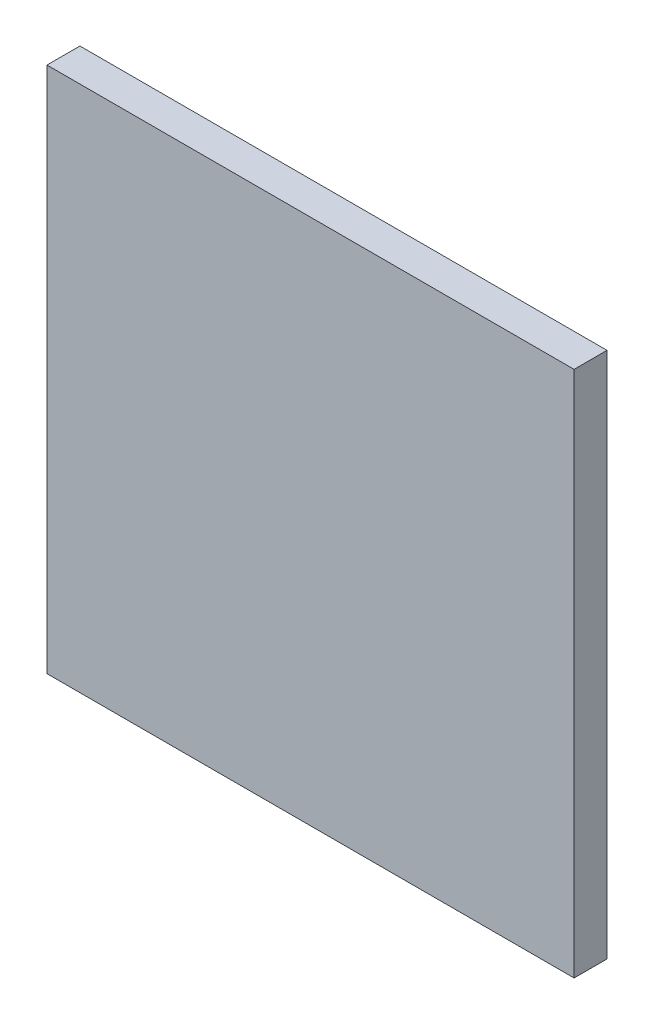
ISO-10303-21;
HEADER;
FILE_DESCRIPTION(('STEP AP214'),'2;1');
FILE_NAME('part.step','',(''),(''),'','','');
FILE_SCHEMA(('AUTOMOTIVE_DESIGN { 1 0 10303 214 1 1 1 1 }'));
ENDSEC;
DATA;
#1=APPLICATION_CONTEXT('core data for automotive mechanical design processes');
#2=APPLICATION_PROTOCOL_DEFINITION('international standard','automotive_design',2000,#1);
#3=PRODUCT_CONTEXT('',#1,'mechanical');
#4=PRODUCT('Part','Part','',(#3));
#5=PRODUCT_RELATED_PRODUCT_CATEGORY('part','',(#4));
#6=PRODUCT_DEFINITION_FORMATION('','',#4);
#7=PRODUCT_DEFINITION_CONTEXT('part definition',#1,'design');
#8=PRODUCT_DEFINITION('design','',#6,#7);
#9=PRODUCT_DEFINITION_SHAPE('','',#8);
#10=(LENGTH_UNIT() NAMED_UNIT(*) SI_UNIT(.MILLI.,.METRE.));
#11=(NAMED_UNIT(*) PLANE_ANGLE_UNIT() SI_UNIT($,.RADIAN.));
#12=(NAMED_UNIT(*) SI_UNIT($,.STERADIAN.) SOLID_ANGLE_UNIT());
#13=UNCERTAINTY_MEASURE_WITH_UNIT(LENGTH_MEASURE(1.E-05),#10,'distance_accuracy_value','');
#14=(GEOMETRIC_REPRESENTATION_CONTEXT(3) GLOBAL_UNCERTAINTY_ASSIGNED_CONTEXT((#13)) GLOBAL_UNIT_ASSIGNED_CONTEXT((#10,
#11,#12)) REPRESENTATION_CONTEXT('',''));
#15=CARTESIAN_POINT('',(0.,0.,0.));
#16=DIRECTION('',(0.,0.,1.));
#17=DIRECTION('',(1.,0.,0.));
#18=AXIS2_PLACEMENT_3D('',#15,#16,#17);
#19=CARTESIAN_POINT('',(-8627.94117434159,-2277.00000000053,38.1));
#20=DIRECTION('',(-1.,0.,0.));
#21=DIRECTION('',(0.,0.,1.));
#22=AXIS2_PLACEMENT_3D('',#19,#20,#21);
#23=PLANE('',#22);
#24=DIRECTION('',(0.,1.,0.));
#25=VECTOR('',#24,1.);
#26=CARTESIAN_POINT('',(-8627.94117434159,-2277.00000000053,0.));
#27=LINE('',#26,#25);
#28=CARTESIAN_POINT('',(-8627.94117434159,-2886.60000000053,0.));
#29=VERTEX_POINT('',#28);
#30=CARTESIAN_POINT('',(-8627.94117434159,-2277.00000000053,0.));
#31=VERTEX_POINT('',#30);
#32=EDGE_CURVE('E96',#29,#31,#27,.T.);
#33=ORIENTED_EDGE('',*,*,#32,.T.);
#34=DIRECTION('',(0.,0.,-1.));
#35=VECTOR('',#34,1.);
#36=CARTESIAN_POINT('',(-8627.94117434159,-2277.00000000053,38.1));
#37=LINE('',#36,#35);
#38=CARTESIAN_POINT('',(-8627.94117434159,-2277.00000000053,38.1));
#39=VERTEX_POINT('',#38);
#40=EDGE_CURVE('E11',#39,#31,#37,.T.);
#41=ORIENTED_EDGE('',*,*,#40,.F.);
#42=DIRECTION('',(0.,1.,0.));
#43=VECTOR('',#42,1.);
#44=CARTESIAN_POINT('',(-8627.94117434159,-2277.00000000053,38.1));
#45=LINE('',#44,#43);
#46=CARTESIAN_POINT('',(-8627.94117434159,-2886.60000000053,38.1));
#47=VERTEX_POINT('',#46);
#48=EDGE_CURVE('E84',#47,#39,#45,.T.);
#49=ORIENTED_EDGE('',*,*,#48,.F.);
#50=DIRECTION('',(0.,0.,-1.));
#51=VECTOR('',#50,1.);
#52=CARTESIAN_POINT('',(-8627.94117434159,-2886.60000000053,38.1));
#53=LINE('',#52,#51);
#54=EDGE_CURVE('E92',#47,#29,#53,.T.);
#55=ORIENTED_EDGE('',*,*,#54,.T.);
#56=EDGE_LOOP('',(#33,#41,#49,#55));
#57=FACE_BOUND('',#56,.T.);
#58=ADVANCED_FACE('F33',(#57),#23,.F.);
#59=CARTESIAN_POINT('',(-9237.54117434159,-2277.00000000053,38.1));
#60=DIRECTION('',(0.,-1.,0.));
#61=DIRECTION('',(0.,0.,-1.));
#62=AXIS2_PLACEMENT_3D('',#59,#60,#61);
#63=PLANE('',#62);
#64=DIRECTION('',(-1.,0.,0.));
#65=VECTOR('',#64,1.);
#66=CARTESIAN_POINT('',(-9237.54117434159,-2277.00000000053,0.));
#67=LINE('',#66,#65);
#68=CARTESIAN_POINT('',(-9237.54117434159,-2277.00000000053,0.));
#69=VERTEX_POINT('',#68);
#70=EDGE_CURVE('E88',#31,#69,#67,.T.);
#71=ORIENTED_EDGE('',*,*,#70,.T.);
#72=DIRECTION('',(0.,0.,-1.));
#73=VECTOR('',#72,1.);
#74=CARTESIAN_POINT('',(-9237.54117434159,-2277.00000000053,38.1));
#75=LINE('',#74,#73);
#76=CARTESIAN_POINT('',(-9237.54117434159,-2277.00000000053,38.1));
#77=VERTEX_POINT('',#76);
#78=EDGE_CURVE('E41',#77,#69,#75,.T.);
#79=ORIENTED_EDGE('',*,*,#78,.F.);
#80=DIRECTION('',(-1.,0.,0.));
#81=VECTOR('',#80,1.);
#82=CARTESIAN_POINT('',(-9237.54117434159,-2277.00000000053,38.1));
#83=LINE('',#82,#81);
#84=EDGE_CURVE('E79',#39,#77,#83,.T.);
#85=ORIENTED_EDGE('',*,*,#84,.F.);
#86=ORIENTED_EDGE('',*,*,#40,.T.);
#87=EDGE_LOOP('',(#71,#79,#85,#86));
#88=FACE_BOUND('',#87,.T.);
#89=ADVANCED_FACE('F87',(#88),#63,.F.);
#90=CARTESIAN_POINT('',(-9237.54117434159,-2277.00000000053,38.1));
#91=DIRECTION('',(1.,0.,0.));
#92=DIRECTION('',(0.,0.,-1.));
#93=AXIS2_PLACEMENT_3D('',#90,#91,#92);
#94=PLANE('',#93);
#95=DIRECTION('',(0.,-1.,0.));
#96=VECTOR('',#95,1.);
#97=CARTESIAN_POINT('',(-9237.54117434159,-2277.00000000053,0.));
#98=LINE('',#97,#96);
#99=CARTESIAN_POINT('',(-9237.54117434159,-2886.60000000053,0.));
#100=VERTEX_POINT('',#99);
#101=EDGE_CURVE('E66',#69,#100,#98,.T.);
#102=ORIENTED_EDGE('',*,*,#101,.T.);
#103=DIRECTION('',(0.,0.,-1.));
#104=VECTOR('',#103,1.);
#105=CARTESIAN_POINT('',(-9237.54117434159,-2886.60000000053,38.1));
#106=LINE('',#105,#104);
#107=CARTESIAN_POINT('',(-9237.54117434159,-2886.60000000053,38.1));
#108=VERTEX_POINT('',#107);
#109=EDGE_CURVE('E89',#108,#100,#106,.T.);
#110=ORIENTED_EDGE('',*,*,#109,.F.);
#111=DIRECTION('',(0.,-1.,0.));
#112=VECTOR('',#111,1.);
#113=CARTESIAN_POINT('',(-9237.54117434159,-2277.00000000053,38.1));
#114=LINE('',#113,#112);
#115=EDGE_CURVE('E82',#77,#108,#114,.T.);
#116=ORIENTED_EDGE('',*,*,#115,.F.);
#117=ORIENTED_EDGE('',*,*,#78,.T.);
#118=EDGE_LOOP('',(#102,#110,#116,#117));
#119=FACE_BOUND('',#118,.T.);
#120=ADVANCED_FACE('F90',(#119),#94,.F.);
#121=CARTESIAN_POINT('',(-9237.54117434159,-2886.60000000053,38.1));
#122=DIRECTION('',(0.,1.,0.));
#123=DIRECTION('',(0.,0.,1.));
#124=AXIS2_PLACEMENT_3D('',#121,#122,#123);
#125=PLANE('',#124);
#126=DIRECTION('',(1.,0.,0.));
#127=VECTOR('',#126,1.);
#128=CARTESIAN_POINT('',(-9237.54117434159,-2886.60000000053,0.));
#129=LINE('',#128,#127);
#130=EDGE_CURVE('E72',#100,#29,#129,.T.);
#131=ORIENTED_EDGE('',*,*,#130,.T.);
#132=ORIENTED_EDGE('',*,*,#54,.F.);
#133=DIRECTION('',(1.,0.,0.));
#134=VECTOR('',#133,1.);
#135=CARTESIAN_POINT('',(-9237.54117434159,-2886.60000000053,38.1));
#136=LINE('',#135,#134);
#137=EDGE_CURVE('E49',#108,#47,#136,.T.);
#138=ORIENTED_EDGE('',*,*,#137,.F.);
#139=ORIENTED_EDGE('',*,*,#109,.T.);
#140=EDGE_LOOP('',(#131,#132,#138,#139));
#141=FACE_BOUND('',#140,.T.);
#142=ADVANCED_FACE('F103',(#141),#125,.F.);
#143=CARTESIAN_POINT('',(0.,0.,38.1));
#144=DIRECTION('',(0.,0.,1.));
#145=DIRECTION('',(1.,0.,0.));
#146=AXIS2_PLACEMENT_3D('',#143,#144,#145);
#147=PLANE('',#146);
#148=ORIENTED_EDGE('',*,*,#48,.T.);
#149=ORIENTED_EDGE('',*,*,#84,.T.);
#150=ORIENTED_EDGE('',*,*,#115,.T.);
#151=ORIENTED_EDGE('',*,*,#137,.T.);
#152=EDGE_LOOP('',(#148,#149,#150,#151));
#153=FACE_BOUND('',#152,.T.);
#154=ADVANCED_FACE('F80',(#153),#147,.T.);
#155=CARTESIAN_POINT('',(0.,0.,0.));
#156=DIRECTION('',(0.,0.,1.));
#157=DIRECTION('',(1.,0.,0.));
#158=AXIS2_PLACEMENT_3D('',#155,#156,#157);
#159=PLANE('',#158);
#160=ORIENTED_EDGE('',*,*,#32,.F.);
#161=ORIENTED_EDGE('',*,*,#130,.F.);
#162=ORIENTED_EDGE('',*,*,#101,.F.);
#163=ORIENTED_EDGE('',*,*,#70,.F.);
#164=EDGE_LOOP('',(#160,#161,#162,#163));
#165=FACE_BOUND('',#164,.T.);
#166=ADVANCED_FACE('F106',(#165),#159,.F.);
#167=CLOSED_SHELL('',(#58,#89,#120,#142,#154,#166));
#168=MANIFOLD_SOLID_BREP('B2',#167);
#169=ADVANCED_BREP_SHAPE_REPRESENTATION('',(#18,#168),#14);
#170=SHAPE_DEFINITION_REPRESENTATION(#9,#169);
ENDSEC;
END-ISO-10303-21;
